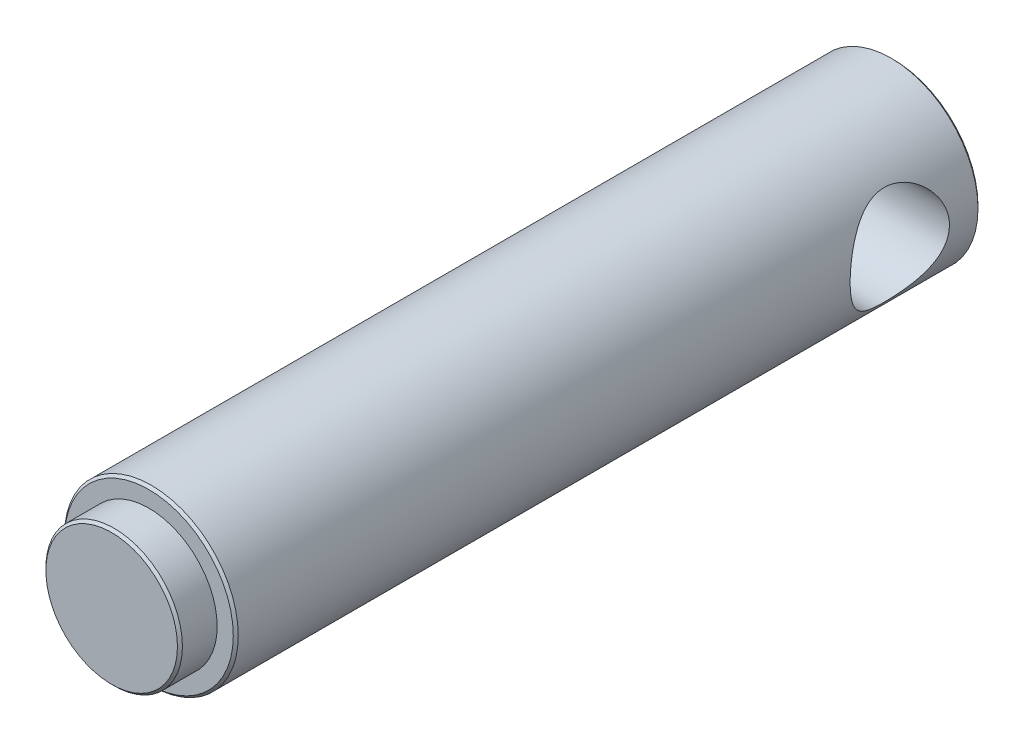
ISO-10303-21;
HEADER;
FILE_DESCRIPTION(('STEP AP214'),'2;1');
FILE_NAME('part.step','',(''),(''),'','','');
FILE_SCHEMA(('AUTOMOTIVE_DESIGN { 1 0 10303 214 1 1 1 1 }'));
ENDSEC;
DATA;
#1=APPLICATION_CONTEXT('core data for automotive mechanical design processes');
#2=APPLICATION_PROTOCOL_DEFINITION('international standard','automotive_design',2000,#1);
#3=PRODUCT_CONTEXT('',#1,'mechanical');
#4=PRODUCT('Part','Part','',(#3));
#5=PRODUCT_RELATED_PRODUCT_CATEGORY('part','',(#4));
#6=PRODUCT_DEFINITION_FORMATION('','',#4);
#7=PRODUCT_DEFINITION_CONTEXT('part definition',#1,'design');
#8=PRODUCT_DEFINITION('design','',#6,#7);
#9=PRODUCT_DEFINITION_SHAPE('','',#8);
#10=(LENGTH_UNIT() NAMED_UNIT(*) SI_UNIT(.MILLI.,.METRE.));
#11=(NAMED_UNIT(*) PLANE_ANGLE_UNIT() SI_UNIT($,.RADIAN.));
#12=(NAMED_UNIT(*) SI_UNIT($,.STERADIAN.) SOLID_ANGLE_UNIT());
#13=UNCERTAINTY_MEASURE_WITH_UNIT(LENGTH_MEASURE(1.E-05),#10,'distance_accuracy_value','');
#14=(GEOMETRIC_REPRESENTATION_CONTEXT(3) GLOBAL_UNCERTAINTY_ASSIGNED_CONTEXT((#13)) GLOBAL_UNIT_ASSIGNED_CONTEXT((#10,
#11,#12)) REPRESENTATION_CONTEXT('',''));
#15=CARTESIAN_POINT('',(0.,0.,0.));
#16=DIRECTION('',(0.,0.,1.));
#17=DIRECTION('',(1.,0.,0.));
#18=AXIS2_PLACEMENT_3D('',#15,#16,#17);
#19=CARTESIAN_POINT('',(0.,0.,60.));
#20=DIRECTION('',(0.,0.,-1.));
#21=DIRECTION('',(-1.,0.,0.));
#22=AXIS2_PLACEMENT_3D('',#19,#20,#21);
#23=CYLINDRICAL_SURFACE('',#22,7.);
#24=CARTESIAN_POINT('',(0.,0.,59.8));
#25=DIRECTION('',(0.,0.,1.));
#26=DIRECTION('',(1.,0.,0.));
#27=AXIS2_PLACEMENT_3D('',#24,#25,#26);
#28=CIRCLE('',#27,7.);
#29=CARTESIAN_POINT('',(7.,0.,59.8));
#30=VERTEX_POINT('',#29);
#31=EDGE_CURVE('E50',#30,#30,#28,.F.);
#32=ORIENTED_EDGE('',*,*,#31,.T.);
#33=EDGE_LOOP('',(#32));
#34=FACE_BOUND('',#33,.T.);
#35=CARTESIAN_POINT('',(0.,0.,0.199999999999999));
#36=DIRECTION('',(0.,0.,1.));
#37=DIRECTION('',(1.,0.,0.));
#38=AXIS2_PLACEMENT_3D('',#35,#36,#37);
#39=CIRCLE('',#38,7.);
#40=CARTESIAN_POINT('',(7.,0.,0.199999999999999));
#41=VERTEX_POINT('',#40);
#42=EDGE_CURVE('E55',#41,#41,#39,.T.);
#43=ORIENTED_EDGE('',*,*,#42,.T.);
#44=EDGE_LOOP('',(#43));
#45=FACE_BOUND('',#44,.T.);
#46=CARTESIAN_POINT('',(-7.,0.,2.5));
#47=CARTESIAN_POINT('',(-6.99999916766608,0.103174353693697,2.50000092622147));
#48=CARTESIAN_POINT('',(-6.99771279419803,0.206380943793602,2.50399838481108));
#49=CARTESIAN_POINT('',(-6.98862259173911,0.412022231403471,2.51993883172418));
#50=CARTESIAN_POINT('',(-6.9818159384365,0.51445640580725,2.53188678759967));
#51=CARTESIAN_POINT('',(-6.96383614374592,0.717934780638678,2.56360740964748));
#52=CARTESIAN_POINT('',(-6.95265431743131,0.818975800015572,2.58339564012929));
#53=CARTESIAN_POINT('',(-6.92620670688288,1.01874471471558,2.63054095618499));
#54=CARTESIAN_POINT('',(-6.91093918050343,1.11747160371512,2.65790127067176));
#55=CARTESIAN_POINT('',(-6.85970259630012,1.40816161924453,2.75057204533383));
#56=CARTESIAN_POINT('',(-6.81818653388811,1.59584032587965,2.82666486949526));
#57=CARTESIAN_POINT('',(-6.72398397587056,1.95516204193538,3.00462659088825));
#58=CARTESIAN_POINT('',(-6.67130059340362,2.12680950125059,3.10648830599675));
#59=CARTESIAN_POINT('',(-6.55482935189651,2.46335779064466,3.34136955995345));
#60=CARTESIAN_POINT('',(-6.4905142322253,2.62687541249465,3.4761083987552));
#61=CARTESIAN_POINT('',(-6.3592893111133,2.93033153816757,3.76911523181843));
#62=CARTESIAN_POINT('',(-6.29237653599831,3.07024197621333,3.92741081714532));
#63=CARTESIAN_POINT('',(-6.15495683988651,3.33788766479095,4.28339266783644));
#64=CARTESIAN_POINT('',(-6.08484959478129,3.46264734932395,4.48349020981621));
#65=CARTESIAN_POINT('',(-5.9582603829287,3.67622523435091,4.90590059000562));
#66=CARTESIAN_POINT('',(-5.90175784209801,3.76509784562976,5.12817915503341));
#67=CARTESIAN_POINT('',(-5.82184477812116,3.88718686207776,5.53829031856916));
#68=CARTESIAN_POINT('',(-5.7938785104293,3.92836679668126,5.722863020078));
#69=CARTESIAN_POINT('',(-5.75562678316024,3.98421352589058,6.09769947964964));
#70=CARTESIAN_POINT('',(-5.74532237121861,3.99890874126274,6.28795691419463));
#71=CARTESIAN_POINT('',(-5.74388373656896,4.000975196418,6.66894934766554));
#72=CARTESIAN_POINT('',(-5.75277569403422,3.9883091206227,6.85968464398821));
#73=CARTESIAN_POINT('',(-5.78845897302995,3.93632981744011,7.23580509401585));
#74=CARTESIAN_POINT('',(-5.81526260986988,3.89699825572749,7.42118647504698));
#75=CARTESIAN_POINT('',(-5.88307389939548,3.79383546739156,7.78132955014229));
#76=CARTESIAN_POINT('',(-5.92402626197588,3.73009950434547,7.95612951440866));
#77=CARTESIAN_POINT('',(-6.01571820888122,3.58033837481382,8.29310086238781));
#78=CARTESIAN_POINT('',(-6.06646153595043,3.49430468035283,8.45526738339173));
#79=CARTESIAN_POINT('',(-6.18185421346708,3.28648201894194,8.78994078044745));
#80=CARTESIAN_POINT('',(-6.24742890906937,3.1611726088396,8.95994019405354));
#81=CARTESIAN_POINT('',(-6.37944698360956,2.88547978627879,9.27818874560391));
#82=CARTESIAN_POINT('',(-6.44589105816034,2.73507500002897,9.42641913874014));
#83=CARTESIAN_POINT('',(-6.54542571666137,2.48331031323023,9.63799899016951));
#84=CARTESIAN_POINT('',(-6.58026752098845,2.38969010220767,9.70988831085213));
#85=CARTESIAN_POINT('',(-6.64745587466658,2.19586698303155,9.84546570152996));
#86=CARTESIAN_POINT('',(-6.67980343263155,2.09566676634966,9.90915709361984));
#87=CARTESIAN_POINT('',(-6.74110581212484,1.88920400254899,10.0277590049286));
#88=CARTESIAN_POINT('',(-6.77006053829395,1.78294128516185,10.0826692773604));
#89=CARTESIAN_POINT('',(-6.82371510380378,1.56508258052671,10.1830541007004));
#90=CARTESIAN_POINT('',(-6.84841752119956,1.45348987750212,10.2285343721975));
#91=CARTESIAN_POINT('',(-6.89129649283952,1.23357577903309,10.3066993147919));
#92=CARTESIAN_POINT('',(-6.90980443827147,1.12555499053736,10.3400476637669));
#93=CARTESIAN_POINT('',(-6.94194552986212,0.906444721241716,10.3975861592155));
#94=CARTESIAN_POINT('',(-6.95558130240596,0.795356928634566,10.4217812402487));
#95=CARTESIAN_POINT('',(-6.97757559140465,0.571076021606548,10.4606588010673));
#96=CARTESIAN_POINT('',(-6.98593711776119,0.457884145982396,10.4753467065239));
#97=CARTESIAN_POINT('',(-6.99713394609541,0.230391688469554,10.4949905747081));
#98=CARTESIAN_POINT('',(-6.99996986667267,0.116091232128085,10.4999476268193));
#99=CARTESIAN_POINT('',(-7.00002603570934,-0.0985985157551596,10.5000452461423));
#100=CARTESIAN_POINT('',(-6.99788721407676,-0.198989300897786,10.4963061961282));
#101=CARTESIAN_POINT('',(-6.98933343073185,-0.399056378144489,10.4813088213231));
#102=CARTESIAN_POINT('',(-6.98291713194041,-0.498732436984936,10.4700481453757));
#103=CARTESIAN_POINT('',(-6.96596218341932,-0.696577503138309,10.4401499654246));
#104=CARTESIAN_POINT('',(-6.95542513725049,-0.794747081263246,10.4215153309134));
#105=CARTESIAN_POINT('',(-6.93048013582528,-0.988966675044398,10.3770977027035));
#106=CARTESIAN_POINT('',(-6.91607068803824,-1.08501585796257,10.3513119526444));
#107=CARTESIAN_POINT('',(-6.86784025244503,-1.36702487624933,10.2642517890796));
#108=CARTESIAN_POINT('',(-6.82881174027116,-1.54910864022513,10.1929238440903));
#109=CARTESIAN_POINT('',(-6.73998795964161,-1.89874210569062,10.0259628625689));
#110=CARTESIAN_POINT('',(-6.69019009930531,-2.06628829476745,9.93032397409965));
#111=CARTESIAN_POINT('',(-6.57794997192013,-2.40101022734591,9.70621407147962));
#112=CARTESIAN_POINT('',(-6.51473109707346,-2.5663321281279,9.57536179531596));
#113=CARTESIAN_POINT('',(-6.38501165185068,-2.87394702055108,9.29007620556996));
#114=CARTESIAN_POINT('',(-6.31850738648143,-3.01621327559794,9.13561591232813));
#115=CARTESIAN_POINT('',(-6.1808435227324,-3.28985374296219,8.78719509976021));
#116=CARTESIAN_POINT('',(-6.10999195942493,-3.41824351694382,8.59075044181712));
#117=CARTESIAN_POINT('',(-5.98062693471643,-3.63986774300697,8.1752906982198));
#118=CARTESIAN_POINT('',(-5.92209712227822,-3.73314891565779,7.95630610549572));
#119=CARTESIAN_POINT('',(-5.83702467135119,-3.86444214295347,7.54952947883427));
#120=CARTESIAN_POINT('',(-5.80632211246573,-3.90999905451075,7.36504701831437));
#121=CARTESIAN_POINT('',(-5.76238064526141,-3.9744867486248,6.98953181493597));
#122=CARTESIAN_POINT('',(-5.74912186682822,-3.99344782797955,6.79850677973534));
#123=CARTESIAN_POINT('',(-5.74198624338643,-4.00370381772298,6.41495445492856));
#124=CARTESIAN_POINT('',(-5.74814842005171,-3.9949430276323,6.22242491715762));
#125=CARTESIAN_POINT('',(-5.77900279264678,-3.95016772474909,5.84204572037987));
#126=CARTESIAN_POINT('',(-5.80370670835904,-3.9141359745247,5.65419909895344));
#127=CARTESIAN_POINT('',(-5.86767618941698,-3.81754070421716,5.29124865360563));
#128=CARTESIAN_POINT('',(-5.90668241023302,-3.75741242514337,5.11598058599029));
#129=CARTESIAN_POINT('',(-5.99499093748335,-3.61484445738469,4.77760210613397));
#130=CARTESIAN_POINT('',(-6.04429703915073,-3.53239654118209,4.61449620547462));
#131=CARTESIAN_POINT('',(-6.15687101376706,-3.33286050522202,4.27831205282259));
#132=CARTESIAN_POINT('',(-6.22111967308758,-3.21239325811873,4.10756571565307));
#133=CARTESIAN_POINT('',(-6.35125248551338,-2.94678350974007,3.78708986044926));
#134=CARTESIAN_POINT('',(-6.417138014762,-2.80161960176932,3.63737878277491));
#135=CARTESIAN_POINT('',(-6.55284552282303,-2.4690476683285,3.34425692233428));
#136=CARTESIAN_POINT('',(-6.62213671268147,-2.27863050588138,3.20394980882597));
#137=CARTESIAN_POINT('',(-6.71654843840246,-1.97466957376768,3.0193704429945));
#138=CARTESIAN_POINT('',(-6.74643988436931,-1.87025550480297,2.96214277062578));
#139=CARTESIAN_POINT('',(-6.80223377050488,-1.65585314541166,2.85687137778826));
#140=CARTESIAN_POINT('',(-6.82813730928139,-1.54586640130947,2.80882512709429));
#141=CARTESIAN_POINT('',(-6.87097539991195,-1.34112548315165,2.73022773804322));
#142=CARTESIAN_POINT('',(-6.88868575445997,-1.24713982863985,2.6980848492583));
#143=CARTESIAN_POINT('',(-6.92049045413031,-1.05647742318428,2.64075678145627));
#144=CARTESIAN_POINT('',(-6.9345854387517,-0.959801151524323,2.61557037189257));
#145=CARTESIAN_POINT('',(-6.95880963464549,-0.764604083132339,2.57248834292976));
#146=CARTESIAN_POINT('',(-6.96894852493489,-0.666088414047044,2.55457492494885));
#147=CARTESIAN_POINT('',(-6.98506655367338,-0.467694279786059,2.52617404906707));
#148=CARTESIAN_POINT('',(-6.99104805863874,-0.367816622968041,2.51568236641729));
#149=CARTESIAN_POINT('',(-6.99658555791355,-0.22311345464658,2.50597773155181));
#150=CARTESIAN_POINT('',(-6.99786511874742,-0.178534436572912,2.50373702273038));
#151=CARTESIAN_POINT('',(-6.99957256458765,-0.0893056299289685,2.50074787823879));
#152=CARTESIAN_POINT('',(-7.00000036025005,-0.0446558344262011,2.49999959911363));
#153=CARTESIAN_POINT('',(-7.,0.,2.5));
#154=B_SPLINE_CURVE_WITH_KNOTS('',3,(#46,#47,#48,#49,#50,#51,#52,#53,#54,#55,#56,#57,#58,#59,
#60,#61,#62,#63,#64,#65,#66,#67,#68,#69,#70,#71,#72,#73,#74,#75,#76,#77,#78,#79,#80,#81,#82,#83,
#84,#85,#86,#87,#88,#89,#90,#91,#92,#93,#94,#95,#96,#97,#98,#99,#100,#101,#102,#103,#104,#105,
#106,#107,#108,#109,#110,#111,#112,#113,#114,#115,#116,#117,#118,#119,#120,#121,#122,#123,#124,
#125,#126,#127,#128,#129,#130,#131,#132,#133,#134,#135,#136,#137,#138,#139,#140,#141,#142,#143,
#144,#145,#146,#147,#148,#149,#150,#151,#152,#153),.UNSPECIFIED.,.T.,.F.,(4,2,2,2,2,2,2,2,2,2,2,
2,2,2,2,2,2,2,2,2,2,2,2,2,2,2,2,2,2,2,2,2,2,2,2,2,2,2,2,2,2,2,2,2,2,2,2,2,2,2,2,2,2,4),(0.,
0.309476324047613,0.619146193855396,0.929433917393154,1.23985415925134,1.85706150441802,
2.47409701507639,3.13570852611815,3.79810114556278,4.53248005222482,5.26574129924115,
5.83676638409033,6.40717833593583,6.97836871188835,7.54995221869045,8.11932690485234,
8.6889196758526,9.34979048117592,10.0112270520966,10.3800420446256,10.7487071063677,
11.1173825273551,11.4858336375217,11.829013046234,12.172007181154,12.5148053990004,
12.8575652378825,13.1586456412119,13.4598202021895,13.7608776795699,14.0620513596593,
14.6575858081394,15.2532637449138,15.910945217437,16.5693839988404,17.3012585698566,
18.0321557302083,18.6071545432669,19.1814978096213,19.7569958138959,20.3328578831258,
20.8987562552321,21.4648635148624,22.118143381826,22.7719924141757,23.5072264951886,
23.87508904646,24.2428500751504,24.5452250849504,24.8475465726779,25.1491236891177,
25.4505289973437,25.5844622240579,25.7184094986542),.UNSPECIFIED.);
#155=CARTESIAN_POINT('',(-7.,0.,2.5));
#156=VERTEX_POINT('',#155);
#157=EDGE_CURVE('E61',#156,#156,#154,.T.);
#158=ORIENTED_EDGE('',*,*,#157,.T.);
#159=EDGE_LOOP('',(#158));
#160=FACE_BOUND('',#159,.T.);
#161=CARTESIAN_POINT('',(7.,0.,2.5));
#162=CARTESIAN_POINT('',(6.99999916766608,-0.103174353693697,2.50000092622147));
#163=CARTESIAN_POINT('',(6.99771279419803,-0.206380943793602,2.50399838481108));
#164=CARTESIAN_POINT('',(6.98862259173911,-0.412022231403471,2.51993883172418));
#165=CARTESIAN_POINT('',(6.9818159384365,-0.51445640580725,2.53188678759967));
#166=CARTESIAN_POINT('',(6.96383614374592,-0.717934780638678,2.56360740964748));
#167=CARTESIAN_POINT('',(6.95265431743131,-0.818975800015572,2.58339564012929));
#168=CARTESIAN_POINT('',(6.92620670688288,-1.01874471471558,2.63054095618499));
#169=CARTESIAN_POINT('',(6.91093918050343,-1.11747160371512,2.65790127067176));
#170=CARTESIAN_POINT('',(6.85970259630012,-1.40816161924453,2.75057204533383));
#171=CARTESIAN_POINT('',(6.81818653388811,-1.59584032587965,2.82666486949526));
#172=CARTESIAN_POINT('',(6.72398397587056,-1.95516204193538,3.00462659088825));
#173=CARTESIAN_POINT('',(6.67130059340362,-2.12680950125059,3.10648830599675));
#174=CARTESIAN_POINT('',(6.55482935189651,-2.46335779064466,3.34136955995345));
#175=CARTESIAN_POINT('',(6.4905142322253,-2.62687541249465,3.4761083987552));
#176=CARTESIAN_POINT('',(6.3592893111133,-2.93033153816757,3.76911523181843));
#177=CARTESIAN_POINT('',(6.29237653599831,-3.07024197621333,3.92741081714532));
#178=CARTESIAN_POINT('',(6.15495683988651,-3.33788766479095,4.28339266783644));
#179=CARTESIAN_POINT('',(6.08484959478129,-3.46264734932395,4.48349020981621));
#180=CARTESIAN_POINT('',(5.9582603829287,-3.67622523435091,4.90590059000562));
#181=CARTESIAN_POINT('',(5.90175784209801,-3.76509784562976,5.12817915503341));
#182=CARTESIAN_POINT('',(5.82184477812116,-3.88718686207776,5.53829031856916));
#183=CARTESIAN_POINT('',(5.7938785104293,-3.92836679668126,5.722863020078));
#184=CARTESIAN_POINT('',(5.75562678316024,-3.98421352589058,6.09769947964964));
#185=CARTESIAN_POINT('',(5.74532237121861,-3.99890874126274,6.28795691419463));
#186=CARTESIAN_POINT('',(5.74388373656896,-4.000975196418,6.66894934766554));
#187=CARTESIAN_POINT('',(5.75277569403422,-3.9883091206227,6.85968464398821));
#188=CARTESIAN_POINT('',(5.78845897302995,-3.93632981744011,7.23580509401585));
#189=CARTESIAN_POINT('',(5.81526260986988,-3.89699825572749,7.42118647504698));
#190=CARTESIAN_POINT('',(5.88307389939548,-3.79383546739156,7.78132955014229));
#191=CARTESIAN_POINT('',(5.92402626197588,-3.73009950434547,7.95612951440866));
#192=CARTESIAN_POINT('',(6.01571820888122,-3.58033837481382,8.29310086238781));
#193=CARTESIAN_POINT('',(6.06646153595043,-3.49430468035283,8.45526738339173));
#194=CARTESIAN_POINT('',(6.18185421346708,-3.28648201894194,8.78994078044745));
#195=CARTESIAN_POINT('',(6.24742890906937,-3.1611726088396,8.95994019405354));
#196=CARTESIAN_POINT('',(6.37944698360956,-2.88547978627879,9.27818874560391));
#197=CARTESIAN_POINT('',(6.44589105816034,-2.73507500002897,9.42641913874014));
#198=CARTESIAN_POINT('',(6.54542571666137,-2.48331031323023,9.63799899016951));
#199=CARTESIAN_POINT('',(6.58026752098845,-2.38969010220767,9.70988831085213));
#200=CARTESIAN_POINT('',(6.64745587466658,-2.19586698303155,9.84546570152996));
#201=CARTESIAN_POINT('',(6.67980343263155,-2.09566676634966,9.90915709361984));
#202=CARTESIAN_POINT('',(6.74110581212484,-1.88920400254899,10.0277590049286));
#203=CARTESIAN_POINT('',(6.77006053829395,-1.78294128516185,10.0826692773604));
#204=CARTESIAN_POINT('',(6.82371510380378,-1.56508258052671,10.1830541007004));
#205=CARTESIAN_POINT('',(6.84841752119956,-1.45348987750212,10.2285343721975));
#206=CARTESIAN_POINT('',(6.89129649283952,-1.23357577903309,10.3066993147919));
#207=CARTESIAN_POINT('',(6.90980443827147,-1.12555499053736,10.3400476637669));
#208=CARTESIAN_POINT('',(6.94194552986212,-0.906444721241716,10.3975861592155));
#209=CARTESIAN_POINT('',(6.95558130240596,-0.795356928634566,10.4217812402487));
#210=CARTESIAN_POINT('',(6.97757559140465,-0.571076021606548,10.4606588010673));
#211=CARTESIAN_POINT('',(6.98593711776119,-0.457884145982396,10.4753467065239));
#212=CARTESIAN_POINT('',(6.99713394609541,-0.230391688469554,10.4949905747081));
#213=CARTESIAN_POINT('',(6.99996986667267,-0.116091232128085,10.4999476268193));
#214=CARTESIAN_POINT('',(7.00002603570934,0.0985985157551596,10.5000452461423));
#215=CARTESIAN_POINT('',(6.99788721407676,0.198989300897786,10.4963061961282));
#216=CARTESIAN_POINT('',(6.98933343073185,0.399056378144489,10.4813088213231));
#217=CARTESIAN_POINT('',(6.98291713194041,0.498732436984936,10.4700481453757));
#218=CARTESIAN_POINT('',(6.96596218341932,0.696577503138309,10.4401499654246));
#219=CARTESIAN_POINT('',(6.95542513725049,0.794747081263246,10.4215153309134));
#220=CARTESIAN_POINT('',(6.93048013582528,0.988966675044398,10.3770977027035));
#221=CARTESIAN_POINT('',(6.91607068803824,1.08501585796257,10.3513119526444));
#222=CARTESIAN_POINT('',(6.86784025244503,1.36702487624933,10.2642517890796));
#223=CARTESIAN_POINT('',(6.82881174027116,1.54910864022513,10.1929238440903));
#224=CARTESIAN_POINT('',(6.73998795964161,1.89874210569062,10.0259628625689));
#225=CARTESIAN_POINT('',(6.69019009930531,2.06628829476745,9.93032397409965));
#226=CARTESIAN_POINT('',(6.57794997192013,2.40101022734591,9.70621407147962));
#227=CARTESIAN_POINT('',(6.51473109707346,2.5663321281279,9.57536179531596));
#228=CARTESIAN_POINT('',(6.38501165185068,2.87394702055108,9.29007620556996));
#229=CARTESIAN_POINT('',(6.31850738648143,3.01621327559794,9.13561591232813));
#230=CARTESIAN_POINT('',(6.1808435227324,3.28985374296219,8.78719509976021));
#231=CARTESIAN_POINT('',(6.10999195942493,3.41824351694382,8.59075044181712));
#232=CARTESIAN_POINT('',(5.98062693471643,3.63986774300697,8.1752906982198));
#233=CARTESIAN_POINT('',(5.92209712227822,3.73314891565779,7.95630610549572));
#234=CARTESIAN_POINT('',(5.83702467135119,3.86444214295347,7.54952947883427));
#235=CARTESIAN_POINT('',(5.80632211246573,3.90999905451075,7.36504701831437));
#236=CARTESIAN_POINT('',(5.76238064526141,3.9744867486248,6.98953181493597));
#237=CARTESIAN_POINT('',(5.74912186682822,3.99344782797955,6.79850677973534));
#238=CARTESIAN_POINT('',(5.74198624338643,4.00370381772298,6.41495445492856));
#239=CARTESIAN_POINT('',(5.74814842005171,3.9949430276323,6.22242491715762));
#240=CARTESIAN_POINT('',(5.77900279264678,3.95016772474909,5.84204572037987));
#241=CARTESIAN_POINT('',(5.80370670835904,3.9141359745247,5.65419909895344));
#242=CARTESIAN_POINT('',(5.86767618941698,3.81754070421716,5.29124865360563));
#243=CARTESIAN_POINT('',(5.90668241023302,3.75741242514337,5.11598058599029));
#244=CARTESIAN_POINT('',(5.99499093748335,3.61484445738469,4.77760210613397));
#245=CARTESIAN_POINT('',(6.04429703915073,3.53239654118209,4.61449620547462));
#246=CARTESIAN_POINT('',(6.15687101376706,3.33286050522202,4.27831205282259));
#247=CARTESIAN_POINT('',(6.22111967308758,3.21239325811873,4.10756571565307));
#248=CARTESIAN_POINT('',(6.35125248551338,2.94678350974007,3.78708986044926));
#249=CARTESIAN_POINT('',(6.417138014762,2.80161960176932,3.63737878277491));
#250=CARTESIAN_POINT('',(6.55284552282303,2.4690476683285,3.34425692233428));
#251=CARTESIAN_POINT('',(6.62213671268147,2.27863050588138,3.20394980882597));
#252=CARTESIAN_POINT('',(6.71654843840246,1.97466957376768,3.0193704429945));
#253=CARTESIAN_POINT('',(6.74643988436931,1.87025550480297,2.96214277062578));
#254=CARTESIAN_POINT('',(6.80223377050488,1.65585314541166,2.85687137778826));
#255=CARTESIAN_POINT('',(6.82813730928139,1.54586640130947,2.80882512709429));
#256=CARTESIAN_POINT('',(6.87097539991195,1.34112548315165,2.73022773804322));
#257=CARTESIAN_POINT('',(6.88868575445997,1.24713982863985,2.6980848492583));
#258=CARTESIAN_POINT('',(6.92049045413031,1.05647742318428,2.64075678145627));
#259=CARTESIAN_POINT('',(6.9345854387517,0.959801151524323,2.61557037189257));
#260=CARTESIAN_POINT('',(6.95880963464549,0.764604083132339,2.57248834292976));
#261=CARTESIAN_POINT('',(6.96894852493489,0.666088414047044,2.55457492494885));
#262=CARTESIAN_POINT('',(6.98506655367338,0.467694279786059,2.52617404906707));
#263=CARTESIAN_POINT('',(6.99104805863874,0.367816622968041,2.51568236641729));
#264=CARTESIAN_POINT('',(6.99658555791355,0.22311345464658,2.50597773155181));
#265=CARTESIAN_POINT('',(6.99786511874742,0.178534436572912,2.50373702273038));
#266=CARTESIAN_POINT('',(6.99957256458765,0.0893056299289685,2.50074787823879));
#267=CARTESIAN_POINT('',(7.00000036025005,0.0446558344262011,2.49999959911363));
#268=CARTESIAN_POINT('',(7.,0.,2.5));
#269=B_SPLINE_CURVE_WITH_KNOTS('',3,(#161,#162,#163,#164,#165,#166,#167,#168,#169,#170,#171,
#172,#173,#174,#175,#176,#177,#178,#179,#180,#181,#182,#183,#184,#185,#186,#187,#188,#189,#190,
#191,#192,#193,#194,#195,#196,#197,#198,#199,#200,#201,#202,#203,#204,#205,#206,#207,#208,#209,
#210,#211,#212,#213,#214,#215,#216,#217,#218,#219,#220,#221,#222,#223,#224,#225,#226,#227,#228,
#229,#230,#231,#232,#233,#234,#235,#236,#237,#238,#239,#240,#241,#242,#243,#244,#245,#246,#247,
#248,#249,#250,#251,#252,#253,#254,#255,#256,#257,#258,#259,#260,#261,#262,#263,#264,#265,#266,
#267,#268),.UNSPECIFIED.,.T.,.F.,(4,2,2,2,2,2,2,2,2,2,2,2,2,2,2,2,2,2,2,2,2,2,2,2,2,2,2,2,2,2,2,
2,2,2,2,2,2,2,2,2,2,2,2,2,2,2,2,2,2,2,2,2,2,4),(0.,0.309476324047613,0.619146193855396,
0.929433917393154,1.23985415925134,1.85706150441802,2.47409701507639,3.13570852611815,
3.79810114556278,4.53248005222482,5.26574129924115,5.83676638409033,6.40717833593583,
6.97836871188835,7.54995221869045,8.11932690485234,8.6889196758526,9.34979048117592,
10.0112270520966,10.3800420446256,10.7487071063677,11.1173825273551,11.4858336375217,
11.829013046234,12.172007181154,12.5148053990004,12.8575652378825,13.1586456412119,
13.4598202021895,13.7608776795699,14.0620513596593,14.6575858081394,15.2532637449138,
15.910945217437,16.5693839988404,17.3012585698566,18.0321557302083,18.6071545432669,
19.1814978096213,19.7569958138959,20.3328578831258,20.8987562552321,21.4648635148624,
22.118143381826,22.7719924141757,23.5072264951886,23.87508904646,24.2428500751504,
24.5452250849504,24.8475465726779,25.1491236891177,25.4505289973437,25.5844622240579,
25.7184094986542),.UNSPECIFIED.);
#270=CARTESIAN_POINT('',(7.,0.,2.5));
#271=VERTEX_POINT('',#270);
#272=EDGE_CURVE('E69',#271,#271,#269,.T.);
#273=ORIENTED_EDGE('',*,*,#272,.T.);
#274=EDGE_LOOP('',(#273));
#275=FACE_BOUND('',#274,.T.);
#276=ADVANCED_FACE('F34',(#34,#45,#160,#275),#23,.T.);
#277=CARTESIAN_POINT('',(0.,0.,60.));
#278=DIRECTION('',(0.,0.,1.));
#279=DIRECTION('',(1.,0.,0.));
#280=AXIS2_PLACEMENT_3D('',#277,#278,#279);
#281=PLANE('',#280);
#282=CARTESIAN_POINT('',(0.,0.,60.));
#283=DIRECTION('',(0.,0.,1.));
#284=DIRECTION('',(1.,0.,0.));
#285=AXIS2_PLACEMENT_3D('',#282,#283,#284);
#286=CIRCLE('',#285,6.80000000000001);
#287=CARTESIAN_POINT('',(6.80000000000001,0.,60.));
#288=VERTEX_POINT('',#287);
#289=EDGE_CURVE('E58',#288,#288,#286,.T.);
#290=ORIENTED_EDGE('',*,*,#289,.T.);
#291=EDGE_LOOP('',(#290));
#292=FACE_BOUND('',#291,.T.);
#293=CARTESIAN_POINT('',(0.,0.,60.));
#294=DIRECTION('',(0.,0.,1.));
#295=DIRECTION('',(1.,0.,0.));
#296=AXIS2_PLACEMENT_3D('',#293,#294,#295);
#297=CIRCLE('',#296,5.5);
#298=CARTESIAN_POINT('',(5.5,0.,60.));
#299=VERTEX_POINT('',#298);
#300=EDGE_CURVE('E110',#299,#299,#297,.T.);
#301=ORIENTED_EDGE('',*,*,#300,.F.);
#302=EDGE_LOOP('',(#301));
#303=FACE_BOUND('',#302,.T.);
#304=ADVANCED_FACE('F92',(#292,#303),#281,.T.);
#305=CARTESIAN_POINT('',(0.,0.,0.));
#306=DIRECTION('',(0.,0.,1.));
#307=DIRECTION('',(1.,0.,0.));
#308=AXIS2_PLACEMENT_3D('',#305,#306,#307);
#309=PLANE('',#308);
#310=CARTESIAN_POINT('',(0.,0.,0.));
#311=DIRECTION('',(0.,0.,1.));
#312=DIRECTION('',(1.,0.,0.));
#313=AXIS2_PLACEMENT_3D('',#310,#311,#312);
#314=CIRCLE('',#313,6.8);
#315=CARTESIAN_POINT('',(6.8,0.,0.));
#316=VERTEX_POINT('',#315);
#317=EDGE_CURVE('E10',#316,#316,#314,.F.);
#318=ORIENTED_EDGE('',*,*,#317,.T.);
#319=EDGE_LOOP('',(#318));
#320=FACE_BOUND('',#319,.T.);
#321=ADVANCED_FACE('F91',(#320),#309,.F.);
#322=CARTESIAN_POINT('',(0.,0.,63.));
#323=DIRECTION('',(0.,0.,-1.));
#324=DIRECTION('',(-1.,0.,0.));
#325=AXIS2_PLACEMENT_3D('',#322,#323,#324);
#326=CYLINDRICAL_SURFACE('',#325,5.5);
#327=CARTESIAN_POINT('',(0.,0.,62.8));
#328=DIRECTION('',(0.,0.,1.));
#329=DIRECTION('',(1.,0.,0.));
#330=AXIS2_PLACEMENT_3D('',#327,#328,#329);
#331=CIRCLE('',#330,5.5);
#332=CARTESIAN_POINT('',(5.5,0.,62.8));
#333=VERTEX_POINT('',#332);
#334=EDGE_CURVE('E42',#333,#333,#331,.F.);
#335=ORIENTED_EDGE('',*,*,#334,.T.);
#336=EDGE_LOOP('',(#335));
#337=FACE_BOUND('',#336,.T.);
#338=ORIENTED_EDGE('',*,*,#300,.T.);
#339=EDGE_LOOP('',(#338));
#340=FACE_BOUND('',#339,.T.);
#341=ADVANCED_FACE('F87',(#337,#340),#326,.T.);
#342=CARTESIAN_POINT('',(0.,0.,63.));
#343=DIRECTION('',(0.,0.,1.));
#344=DIRECTION('',(1.,0.,0.));
#345=AXIS2_PLACEMENT_3D('',#342,#343,#344);
#346=PLANE('',#345);
#347=CARTESIAN_POINT('',(0.,0.,63.));
#348=DIRECTION('',(0.,0.,1.));
#349=DIRECTION('',(1.,0.,0.));
#350=AXIS2_PLACEMENT_3D('',#347,#348,#349);
#351=CIRCLE('',#350,5.29999999999999);
#352=CARTESIAN_POINT('',(5.29999999999999,0.,63.));
#353=VERTEX_POINT('',#352);
#354=EDGE_CURVE('E46',#353,#353,#351,.T.);
#355=ORIENTED_EDGE('',*,*,#354,.T.);
#356=EDGE_LOOP('',(#355));
#357=FACE_BOUND('',#356,.T.);
#358=ADVANCED_FACE('F82',(#357),#346,.T.);
#359=CARTESIAN_POINT('',(-7.,0.,6.5));
#360=DIRECTION('',(1.,0.,0.));
#361=DIRECTION('',(0.,0.,-1.));
#362=AXIS2_PLACEMENT_3D('',#359,#360,#361);
#363=CYLINDRICAL_SURFACE('',#362,4.);
#364=ORIENTED_EDGE('',*,*,#272,.F.);
#365=EDGE_LOOP('',(#364));
#366=FACE_BOUND('',#365,.T.);
#367=ORIENTED_EDGE('',*,*,#157,.F.);
#368=EDGE_LOOP('',(#367));
#369=FACE_BOUND('',#368,.T.);
#370=ADVANCED_FACE('F77',(#366,#369),#363,.F.);
#371=CARTESIAN_POINT('',(0.,0.,60.));
#372=DIRECTION('',(0.,0.,-1.));
#373=DIRECTION('',(-1.,0.,0.));
#374=AXIS2_PLACEMENT_3D('',#371,#372,#373);
#375=CONICAL_SURFACE('',#374,6.80000000000001,0.78539816339745);
#376=ORIENTED_EDGE('',*,*,#31,.F.);
#377=EDGE_LOOP('',(#376));
#378=FACE_BOUND('',#377,.T.);
#379=ORIENTED_EDGE('',*,*,#289,.F.);
#380=EDGE_LOOP('',(#379));
#381=FACE_BOUND('',#380,.T.);
#382=ADVANCED_FACE('F81',(#378,#381),#375,.T.);
#383=CARTESIAN_POINT('',(0.,0.,63.));
#384=DIRECTION('',(0.,0.,-1.));
#385=DIRECTION('',(-1.,0.,0.));
#386=AXIS2_PLACEMENT_3D('',#383,#384,#385);
#387=CONICAL_SURFACE('',#386,5.29999999999999,0.785398163397453);
#388=ORIENTED_EDGE('',*,*,#334,.F.);
#389=EDGE_LOOP('',(#388));
#390=FACE_BOUND('',#389,.T.);
#391=ORIENTED_EDGE('',*,*,#354,.F.);
#392=EDGE_LOOP('',(#391));
#393=FACE_BOUND('',#392,.T.);
#394=ADVANCED_FACE('F118',(#390,#393),#387,.T.);
#395=CARTESIAN_POINT('',(0.,0.,0.199999999999999));
#396=DIRECTION('',(0.,0.,1.));
#397=DIRECTION('',(1.,0.,0.));
#398=AXIS2_PLACEMENT_3D('',#395,#396,#397);
#399=CONICAL_SURFACE('',#398,7.,0.78539816339745);
#400=ORIENTED_EDGE('',*,*,#317,.F.);
#401=EDGE_LOOP('',(#400));
#402=FACE_BOUND('',#401,.T.);
#403=ORIENTED_EDGE('',*,*,#42,.F.);
#404=EDGE_LOOP('',(#403));
#405=FACE_BOUND('',#404,.T.);
#406=ADVANCED_FACE('F37',(#402,#405),#399,.T.);
#407=CLOSED_SHELL('',(#276,#304,#321,#341,#358,#370,#382,#394,#406));
#408=MANIFOLD_SOLID_BREP('B2',#407);
#409=ADVANCED_BREP_SHAPE_REPRESENTATION('',(#18,#408),#14);
#410=SHAPE_DEFINITION_REPRESENTATION(#9,#409);
ENDSEC;
END-ISO-10303-21;
